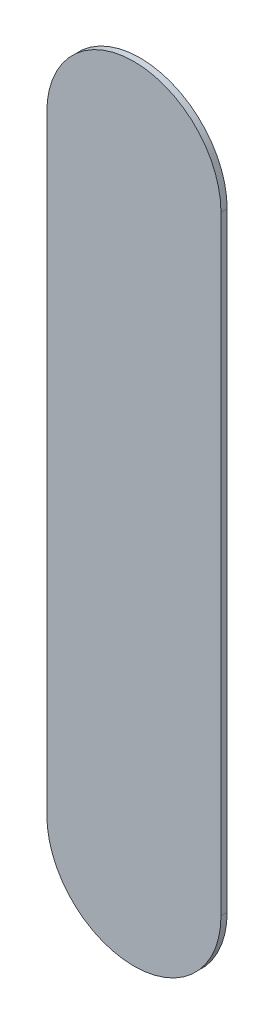
ISO-10303-21;
HEADER;
FILE_DESCRIPTION(('STEP AP214'),'2;1');
FILE_NAME('part.step','',(''),(''),'','','');
FILE_SCHEMA(('AUTOMOTIVE_DESIGN { 1 0 10303 214 1 1 1 1 }'));
ENDSEC;
DATA;
#1=APPLICATION_CONTEXT('core data for automotive mechanical design processes');
#2=APPLICATION_PROTOCOL_DEFINITION('international standard','automotive_design',2000,#1);
#3=PRODUCT_CONTEXT('',#1,'mechanical');
#4=PRODUCT('Part','Part','',(#3));
#5=PRODUCT_RELATED_PRODUCT_CATEGORY('part','',(#4));
#6=PRODUCT_DEFINITION_FORMATION('','',#4);
#7=PRODUCT_DEFINITION_CONTEXT('part definition',#1,'design');
#8=PRODUCT_DEFINITION('design','',#6,#7);
#9=PRODUCT_DEFINITION_SHAPE('','',#8);
#10=(LENGTH_UNIT() NAMED_UNIT(*) SI_UNIT(.MILLI.,.METRE.));
#11=(NAMED_UNIT(*) PLANE_ANGLE_UNIT() SI_UNIT($,.RADIAN.));
#12=(NAMED_UNIT(*) SI_UNIT($,.STERADIAN.) SOLID_ANGLE_UNIT());
#13=UNCERTAINTY_MEASURE_WITH_UNIT(LENGTH_MEASURE(1.E-05),#10,'distance_accuracy_value','');
#14=(GEOMETRIC_REPRESENTATION_CONTEXT(3) GLOBAL_UNCERTAINTY_ASSIGNED_CONTEXT((#13)) GLOBAL_UNIT_ASSIGNED_CONTEXT((#10,
#11,#12)) REPRESENTATION_CONTEXT('',''));
#15=CARTESIAN_POINT('',(0.,0.,0.));
#16=DIRECTION('',(0.,0.,1.));
#17=DIRECTION('',(1.,0.,0.));
#18=AXIS2_PLACEMENT_3D('',#15,#16,#17);
#19=CARTESIAN_POINT('',(40.39999794,73.00002418,0.));
#20=DIRECTION('',(-1.,0.,0.));
#21=DIRECTION('',(0.,1.,0.));
#22=AXIS2_PLACEMENT_3D('',#19,#20,#21);
#23=PLANE('',#22);
#24=DIRECTION('',(0.,1.,0.));
#25=VECTOR('',#24,1.);
#26=CARTESIAN_POINT('',(40.39999794,73.00002418,0.03556));
#27=LINE('',#26,#25);
#28=CARTESIAN_POINT('',(40.39999794,73.00002418,0.03556));
#29=VERTEX_POINT('',#28);
#30=CARTESIAN_POINT('',(40.39999794,76.4999994,0.03556));
#31=VERTEX_POINT('',#30);
#32=EDGE_CURVE('E11',#29,#31,#27,.T.);
#33=ORIENTED_EDGE('',*,*,#32,.F.);
#34=DIRECTION('',(0.,0.,1.));
#35=VECTOR('',#34,1.);
#36=CARTESIAN_POINT('',(40.39999794,73.00002418,0.));
#37=LINE('',#36,#35);
#38=CARTESIAN_POINT('',(40.39999794,73.00002418,0.));
#39=VERTEX_POINT('',#38);
#40=EDGE_CURVE('E24',#39,#29,#37,.T.);
#41=ORIENTED_EDGE('',*,*,#40,.F.);
#42=DIRECTION('',(0.,1.,0.));
#43=VECTOR('',#42,1.);
#44=CARTESIAN_POINT('',(40.39999794,73.00002418,0.));
#45=LINE('',#44,#43);
#46=CARTESIAN_POINT('',(40.39999794,76.4999994,0.));
#47=VERTEX_POINT('',#46);
#48=EDGE_CURVE('E75',#39,#47,#45,.T.);
#49=ORIENTED_EDGE('',*,*,#48,.T.);
#50=DIRECTION('',(0.,0.,1.));
#51=VECTOR('',#50,1.);
#52=CARTESIAN_POINT('',(40.39999794,76.4999994,0.));
#53=LINE('',#52,#51);
#54=EDGE_CURVE('E37',#47,#31,#53,.T.);
#55=ORIENTED_EDGE('',*,*,#54,.T.);
#56=EDGE_LOOP('',(#33,#41,#49,#55));
#57=FACE_BOUND('',#56,.T.);
#58=ADVANCED_FACE('F17',(#57),#23,.F.);
#59=CARTESIAN_POINT('',(39.89999894,76.4999994,0.));
#60=DIRECTION('',(0.,0.,-1.));
#61=DIRECTION('',(1.,0.,0.));
#62=AXIS2_PLACEMENT_3D('',#59,#60,#61);
#63=CYLINDRICAL_SURFACE('',#62,0.499999000000002);
#64=CARTESIAN_POINT('',(39.89999894,76.4999994,0.03556));
#65=DIRECTION('',(0.,0.,1.));
#66=DIRECTION('',(1.,0.,0.));
#67=AXIS2_PLACEMENT_3D('',#64,#65,#66);
#68=CIRCLE('',#67,0.499999000000002);
#69=CARTESIAN_POINT('',(39.39999994,76.4999994,0.03556));
#70=VERTEX_POINT('',#69);
#71=EDGE_CURVE('E83',#31,#70,#68,.T.);
#72=ORIENTED_EDGE('',*,*,#71,.F.);
#73=ORIENTED_EDGE('',*,*,#54,.F.);
#74=CARTESIAN_POINT('',(39.89999894,76.4999994,0.));
#75=DIRECTION('',(0.,0.,1.));
#76=DIRECTION('',(1.,0.,0.));
#77=AXIS2_PLACEMENT_3D('',#74,#75,#76);
#78=CIRCLE('',#77,0.499999000000002);
#79=CARTESIAN_POINT('',(39.39999994,76.4999994,0.));
#80=VERTEX_POINT('',#79);
#81=EDGE_CURVE('E81',#47,#80,#78,.T.);
#82=ORIENTED_EDGE('',*,*,#81,.T.);
#83=DIRECTION('',(0.,0.,1.));
#84=VECTOR('',#83,1.);
#85=CARTESIAN_POINT('',(39.39999994,76.4999994,0.));
#86=LINE('',#85,#84);
#87=EDGE_CURVE('E67',#80,#70,#86,.T.);
#88=ORIENTED_EDGE('',*,*,#87,.T.);
#89=EDGE_LOOP('',(#72,#73,#82,#88));
#90=FACE_BOUND('',#89,.T.);
#91=ADVANCED_FACE('F89',(#90),#63,.T.);
#92=CARTESIAN_POINT('',(39.39999994,76.4999994,0.));
#93=DIRECTION('',(1.,0.,0.));
#94=DIRECTION('',(0.,-1.,0.));
#95=AXIS2_PLACEMENT_3D('',#92,#93,#94);
#96=PLANE('',#95);
#97=DIRECTION('',(0.,-1.,0.));
#98=VECTOR('',#97,1.);
#99=CARTESIAN_POINT('',(39.39999994,76.4999994,0.03556));
#100=LINE('',#99,#98);
#101=CARTESIAN_POINT('',(39.39999994,73.00002418,0.03556));
#102=VERTEX_POINT('',#101);
#103=EDGE_CURVE('E71',#70,#102,#100,.T.);
#104=ORIENTED_EDGE('',*,*,#103,.F.);
#105=ORIENTED_EDGE('',*,*,#87,.F.);
#106=DIRECTION('',(0.,-1.,0.));
#107=VECTOR('',#106,1.);
#108=CARTESIAN_POINT('',(39.39999994,76.4999994,0.));
#109=LINE('',#108,#107);
#110=CARTESIAN_POINT('',(39.39999994,73.00002418,0.));
#111=VERTEX_POINT('',#110);
#112=EDGE_CURVE('E63',#80,#111,#109,.T.);
#113=ORIENTED_EDGE('',*,*,#112,.T.);
#114=DIRECTION('',(0.,0.,1.));
#115=VECTOR('',#114,1.);
#116=CARTESIAN_POINT('',(39.39999994,73.00002418,0.));
#117=LINE('',#116,#115);
#118=EDGE_CURVE('E53',#111,#102,#117,.T.);
#119=ORIENTED_EDGE('',*,*,#118,.T.);
#120=EDGE_LOOP('',(#104,#105,#113,#119));
#121=FACE_BOUND('',#120,.T.);
#122=ADVANCED_FACE('F66',(#121),#96,.F.);
#123=CARTESIAN_POINT('',(39.89999894,73.00002418,0.));
#124=DIRECTION('',(0.,0.,-1.));
#125=DIRECTION('',(-1.,0.,0.));
#126=AXIS2_PLACEMENT_3D('',#123,#124,#125);
#127=CYLINDRICAL_SURFACE('',#126,0.499999000000002);
#128=CARTESIAN_POINT('',(39.89999894,73.00002418,0.03556));
#129=DIRECTION('',(0.,0.,1.));
#130=DIRECTION('',(-1.,0.,0.));
#131=AXIS2_PLACEMENT_3D('',#128,#129,#130);
#132=CIRCLE('',#131,0.499999000000002);
#133=EDGE_CURVE('E59',#102,#29,#132,.T.);
#134=ORIENTED_EDGE('',*,*,#133,.F.);
#135=ORIENTED_EDGE('',*,*,#118,.F.);
#136=CARTESIAN_POINT('',(39.89999894,73.00002418,0.));
#137=DIRECTION('',(0.,0.,1.));
#138=DIRECTION('',(-1.,0.,0.));
#139=AXIS2_PLACEMENT_3D('',#136,#137,#138);
#140=CIRCLE('',#139,0.499999000000002);
#141=EDGE_CURVE('E57',#111,#39,#140,.T.);
#142=ORIENTED_EDGE('',*,*,#141,.T.);
#143=ORIENTED_EDGE('',*,*,#40,.T.);
#144=EDGE_LOOP('',(#134,#135,#142,#143));
#145=FACE_BOUND('',#144,.T.);
#146=ADVANCED_FACE('F55',(#145),#127,.T.);
#147=CARTESIAN_POINT('',(40.39999794,73.00002418,0.));
#148=DIRECTION('',(0.,0.,-1.));
#149=DIRECTION('',(-1.,0.,0.));
#150=AXIS2_PLACEMENT_3D('',#147,#148,#149);
#151=PLANE('',#150);
#152=ORIENTED_EDGE('',*,*,#141,.F.);
#153=ORIENTED_EDGE('',*,*,#112,.F.);
#154=ORIENTED_EDGE('',*,*,#81,.F.);
#155=ORIENTED_EDGE('',*,*,#48,.F.);
#156=EDGE_LOOP('',(#152,#153,#154,#155));
#157=FACE_BOUND('',#156,.T.);
#158=ADVANCED_FACE('F74',(#157),#151,.T.);
#159=CARTESIAN_POINT('',(40.39999794,73.00002418,0.03556));
#160=DIRECTION('',(0.,0.,-1.));
#161=DIRECTION('',(-1.,0.,0.));
#162=AXIS2_PLACEMENT_3D('',#159,#160,#161);
#163=PLANE('',#162);
#164=ORIENTED_EDGE('',*,*,#32,.T.);
#165=ORIENTED_EDGE('',*,*,#71,.T.);
#166=ORIENTED_EDGE('',*,*,#103,.T.);
#167=ORIENTED_EDGE('',*,*,#133,.T.);
#168=EDGE_LOOP('',(#164,#165,#166,#167));
#169=FACE_BOUND('',#168,.T.);
#170=ADVANCED_FACE('F91',(#169),#163,.F.);
#171=CLOSED_SHELL('',(#58,#91,#122,#146,#158,#170));
#172=MANIFOLD_SOLID_BREP('B1',#171);
#173=ADVANCED_BREP_SHAPE_REPRESENTATION('',(#18,#172),#14);
#174=SHAPE_DEFINITION_REPRESENTATION(#9,#173);
ENDSEC;
END-ISO-10303-21;
